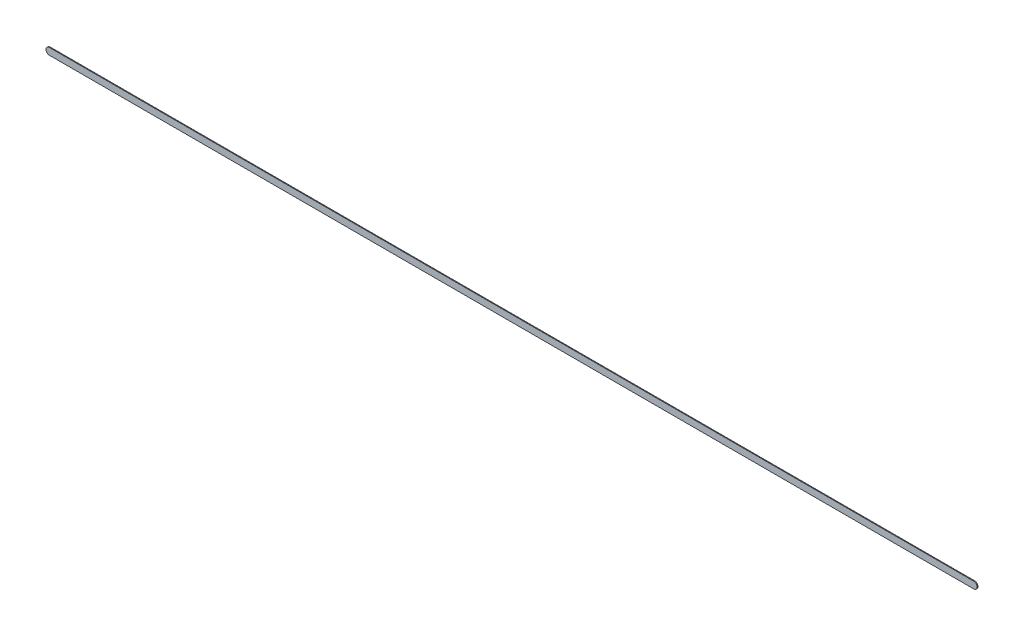
ISO-10303-21;
HEADER;
FILE_DESCRIPTION(('STEP AP214'),'2;1');
FILE_NAME('part.step','',(''),(''),'','','');
FILE_SCHEMA(('AUTOMOTIVE_DESIGN { 1 0 10303 214 1 1 1 1 }'));
ENDSEC;
DATA;
#1=APPLICATION_CONTEXT('core data for automotive mechanical design processes');
#2=APPLICATION_PROTOCOL_DEFINITION('international standard','automotive_design',2000,#1);
#3=PRODUCT_CONTEXT('',#1,'mechanical');
#4=PRODUCT('Part','Part','',(#3));
#5=PRODUCT_RELATED_PRODUCT_CATEGORY('part','',(#4));
#6=PRODUCT_DEFINITION_FORMATION('','',#4);
#7=PRODUCT_DEFINITION_CONTEXT('part definition',#1,'design');
#8=PRODUCT_DEFINITION('design','',#6,#7);
#9=PRODUCT_DEFINITION_SHAPE('','',#8);
#10=(LENGTH_UNIT() NAMED_UNIT(*) SI_UNIT(.MILLI.,.METRE.));
#11=(NAMED_UNIT(*) PLANE_ANGLE_UNIT() SI_UNIT($,.RADIAN.));
#12=(NAMED_UNIT(*) SI_UNIT($,.STERADIAN.) SOLID_ANGLE_UNIT());
#13=UNCERTAINTY_MEASURE_WITH_UNIT(LENGTH_MEASURE(1.E-05),#10,'distance_accuracy_value','');
#14=(GEOMETRIC_REPRESENTATION_CONTEXT(3) GLOBAL_UNCERTAINTY_ASSIGNED_CONTEXT((#13)) GLOBAL_UNIT_ASSIGNED_CONTEXT((#10,
#11,#12)) REPRESENTATION_CONTEXT('',''));
#15=CARTESIAN_POINT('',(0.,0.,0.));
#16=DIRECTION('',(0.,0.,1.));
#17=DIRECTION('',(1.,0.,0.));
#18=AXIS2_PLACEMENT_3D('',#15,#16,#17);
#19=CARTESIAN_POINT('',(117.78,-88.93,1.635));
#20=DIRECTION('',(0.,0.,1.));
#21=DIRECTION('',(1.,0.,0.));
#22=AXIS2_PLACEMENT_3D('',#19,#20,#21);
#23=PLANE('',#22);
#24=DIRECTION('',(-1.,0.,0.));
#25=VECTOR('',#24,1.);
#26=CARTESIAN_POINT('',(117.78,-88.93,1.635));
#27=LINE('',#26,#25);
#28=CARTESIAN_POINT('',(117.78,-88.93,1.635));
#29=VERTEX_POINT('',#28);
#30=CARTESIAN_POINT('',(76.8,-88.93,1.635));
#31=VERTEX_POINT('',#30);
#32=EDGE_CURVE('E94',#29,#31,#27,.T.);
#33=ORIENTED_EDGE('',*,*,#32,.T.);
#34=CARTESIAN_POINT('',(76.8,-89.08,1.635));
#35=DIRECTION('',(0.,0.,1.));
#36=DIRECTION('',(0.,1.,0.));
#37=AXIS2_PLACEMENT_3D('',#34,#35,#36);
#38=CIRCLE('',#37,0.15);
#39=CARTESIAN_POINT('',(76.8,-89.23,1.635));
#40=VERTEX_POINT('',#39);
#41=EDGE_CURVE('E90',#31,#40,#38,.T.);
#42=ORIENTED_EDGE('',*,*,#41,.T.);
#43=DIRECTION('',(1.,0.,0.));
#44=VECTOR('',#43,1.);
#45=CARTESIAN_POINT('',(76.8,-89.23,1.635));
#46=LINE('',#45,#44);
#47=CARTESIAN_POINT('',(117.78,-89.23,1.635));
#48=VERTEX_POINT('',#47);
#49=EDGE_CURVE('E113',#40,#48,#46,.T.);
#50=ORIENTED_EDGE('',*,*,#49,.T.);
#51=CARTESIAN_POINT('',(117.78,-89.08,1.635));
#52=DIRECTION('',(0.,0.,1.));
#53=DIRECTION('',(0.,-1.,0.));
#54=AXIS2_PLACEMENT_3D('',#51,#52,#53);
#55=CIRCLE('',#54,0.15);
#56=EDGE_CURVE('E11',#48,#29,#55,.T.);
#57=ORIENTED_EDGE('',*,*,#56,.T.);
#58=EDGE_LOOP('',(#33,#42,#50,#57));
#59=FACE_BOUND('',#58,.T.);
#60=ADVANCED_FACE('F17',(#59),#23,.T.);
#61=CARTESIAN_POINT('',(117.78,-88.93,1.6));
#62=DIRECTION('',(0.,0.,1.));
#63=DIRECTION('',(1.,0.,0.));
#64=AXIS2_PLACEMENT_3D('',#61,#62,#63);
#65=PLANE('',#64);
#66=CARTESIAN_POINT('',(117.78,-89.08,1.6));
#67=DIRECTION('',(0.,0.,1.));
#68=DIRECTION('',(0.,-1.,0.));
#69=AXIS2_PLACEMENT_3D('',#66,#67,#68);
#70=CIRCLE('',#69,0.15);
#71=CARTESIAN_POINT('',(117.78,-89.23,1.6));
#72=VERTEX_POINT('',#71);
#73=CARTESIAN_POINT('',(117.78,-88.93,1.6));
#74=VERTEX_POINT('',#73);
#75=EDGE_CURVE('E20',#72,#74,#70,.T.);
#76=ORIENTED_EDGE('',*,*,#75,.F.);
#77=DIRECTION('',(1.,0.,0.));
#78=VECTOR('',#77,1.);
#79=CARTESIAN_POINT('',(76.8,-89.23,1.6));
#80=LINE('',#79,#78);
#81=CARTESIAN_POINT('',(76.8,-89.23,1.6));
#82=VERTEX_POINT('',#81);
#83=EDGE_CURVE('E59',#82,#72,#80,.T.);
#84=ORIENTED_EDGE('',*,*,#83,.F.);
#85=CARTESIAN_POINT('',(76.8,-89.08,1.6));
#86=DIRECTION('',(0.,0.,1.));
#87=DIRECTION('',(0.,1.,0.));
#88=AXIS2_PLACEMENT_3D('',#85,#86,#87);
#89=CIRCLE('',#88,0.15);
#90=CARTESIAN_POINT('',(76.8,-88.93,1.6));
#91=VERTEX_POINT('',#90);
#92=EDGE_CURVE('E75',#91,#82,#89,.T.);
#93=ORIENTED_EDGE('',*,*,#92,.F.);
#94=DIRECTION('',(-1.,0.,0.));
#95=VECTOR('',#94,1.);
#96=CARTESIAN_POINT('',(117.78,-88.93,1.6));
#97=LINE('',#96,#95);
#98=EDGE_CURVE('E79',#74,#91,#97,.T.);
#99=ORIENTED_EDGE('',*,*,#98,.F.);
#100=EDGE_LOOP('',(#76,#84,#93,#99));
#101=FACE_BOUND('',#100,.T.);
#102=ADVANCED_FACE('F77',(#101),#65,.F.);
#103=CARTESIAN_POINT('',(117.78,-89.08,1.6));
#104=DIRECTION('',(0.,0.,-1.));
#105=DIRECTION('',(0.,-1.,0.));
#106=AXIS2_PLACEMENT_3D('',#103,#104,#105);
#107=CYLINDRICAL_SURFACE('',#106,0.15);
#108=ORIENTED_EDGE('',*,*,#75,.T.);
#109=DIRECTION('',(0.,0.,1.));
#110=VECTOR('',#109,1.);
#111=CARTESIAN_POINT('',(117.78,-88.93,1.6));
#112=LINE('',#111,#110);
#113=EDGE_CURVE('E84',#74,#29,#112,.T.);
#114=ORIENTED_EDGE('',*,*,#113,.T.);
#115=ORIENTED_EDGE('',*,*,#56,.F.);
#116=DIRECTION('',(0.,0.,1.));
#117=VECTOR('',#116,1.);
#118=CARTESIAN_POINT('',(117.78,-89.23,1.6));
#119=LINE('',#118,#117);
#120=EDGE_CURVE('E105',#72,#48,#119,.T.);
#121=ORIENTED_EDGE('',*,*,#120,.F.);
#122=EDGE_LOOP('',(#108,#114,#115,#121));
#123=FACE_BOUND('',#122,.T.);
#124=ADVANCED_FACE('F123',(#123),#107,.T.);
#125=CARTESIAN_POINT('',(76.8,-89.23,1.6));
#126=DIRECTION('',(0.,1.,0.));
#127=DIRECTION('',(1.,0.,0.));
#128=AXIS2_PLACEMENT_3D('',#125,#126,#127);
#129=PLANE('',#128);
#130=ORIENTED_EDGE('',*,*,#83,.T.);
#131=ORIENTED_EDGE('',*,*,#120,.T.);
#132=ORIENTED_EDGE('',*,*,#49,.F.);
#133=DIRECTION('',(0.,0.,1.));
#134=VECTOR('',#133,1.);
#135=CARTESIAN_POINT('',(76.8,-89.23,1.6));
#136=LINE('',#135,#134);
#137=EDGE_CURVE('E83',#82,#40,#136,.T.);
#138=ORIENTED_EDGE('',*,*,#137,.F.);
#139=EDGE_LOOP('',(#130,#131,#132,#138));
#140=FACE_BOUND('',#139,.T.);
#141=ADVANCED_FACE('F122',(#140),#129,.F.);
#142=CARTESIAN_POINT('',(76.8,-89.08,1.6));
#143=DIRECTION('',(0.,0.,-1.));
#144=DIRECTION('',(0.,1.,0.));
#145=AXIS2_PLACEMENT_3D('',#142,#143,#144);
#146=CYLINDRICAL_SURFACE('',#145,0.15);
#147=ORIENTED_EDGE('',*,*,#92,.T.);
#148=ORIENTED_EDGE('',*,*,#137,.T.);
#149=ORIENTED_EDGE('',*,*,#41,.F.);
#150=DIRECTION('',(0.,0.,1.));
#151=VECTOR('',#150,1.);
#152=CARTESIAN_POINT('',(76.8,-88.93,1.6));
#153=LINE('',#152,#151);
#154=EDGE_CURVE('E87',#91,#31,#153,.T.);
#155=ORIENTED_EDGE('',*,*,#154,.F.);
#156=EDGE_LOOP('',(#147,#148,#149,#155));
#157=FACE_BOUND('',#156,.T.);
#158=ADVANCED_FACE('F88',(#157),#146,.T.);
#159=CARTESIAN_POINT('',(117.78,-88.93,1.6));
#160=DIRECTION('',(0.,-1.,0.));
#161=DIRECTION('',(0.,0.,-1.));
#162=AXIS2_PLACEMENT_3D('',#159,#160,#161);
#163=PLANE('',#162);
#164=ORIENTED_EDGE('',*,*,#98,.T.);
#165=ORIENTED_EDGE('',*,*,#154,.T.);
#166=ORIENTED_EDGE('',*,*,#32,.F.);
#167=ORIENTED_EDGE('',*,*,#113,.F.);
#168=EDGE_LOOP('',(#164,#165,#166,#167));
#169=FACE_BOUND('',#168,.T.);
#170=ADVANCED_FACE('F97',(#169),#163,.F.);
#171=CLOSED_SHELL('',(#60,#102,#124,#141,#158,#170));
#172=MANIFOLD_SOLID_BREP('B1',#171);
#173=ADVANCED_BREP_SHAPE_REPRESENTATION('',(#18,#172),#14);
#174=SHAPE_DEFINITION_REPRESENTATION(#9,#173);
ENDSEC;
END-ISO-10303-21;
